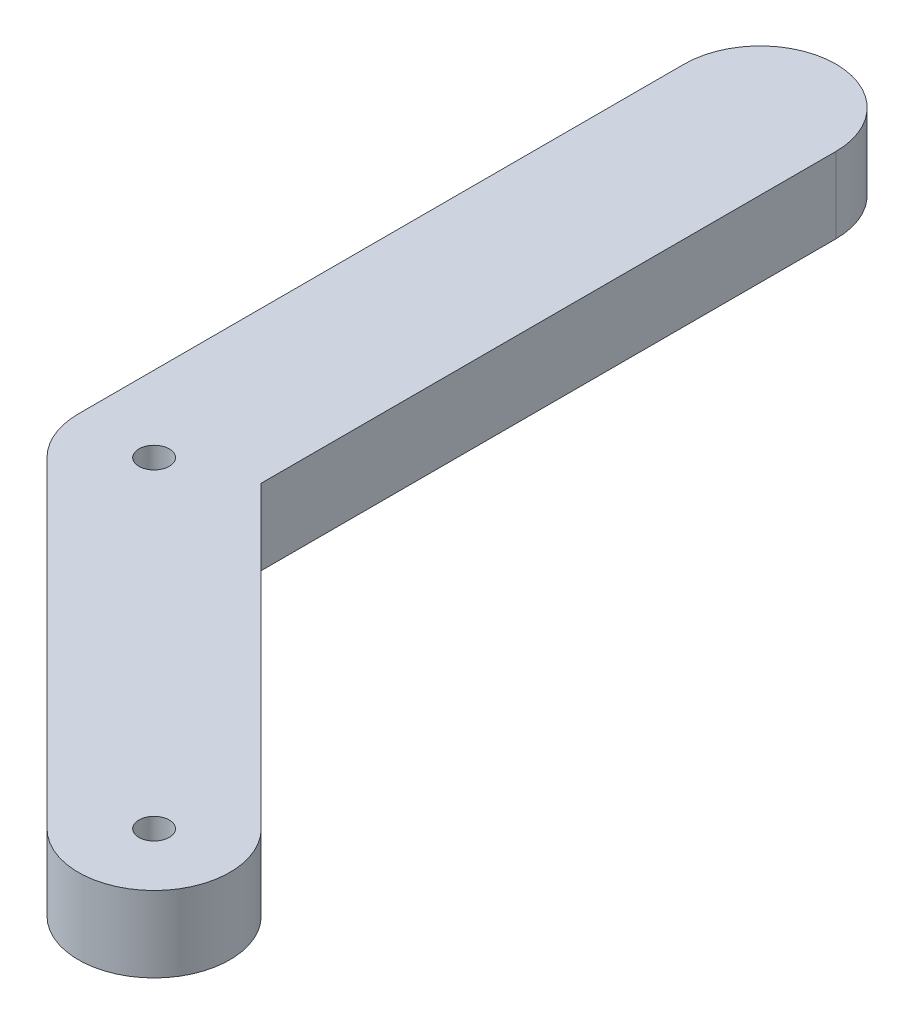
ISO-10303-21;
HEADER;
FILE_DESCRIPTION(('STEP AP214'),'2;1');
FILE_NAME('part.step','',(''),(''),'','','');
FILE_SCHEMA(('AUTOMOTIVE_DESIGN { 1 0 10303 214 1 1 1 1 }'));
ENDSEC;
DATA;
#1=APPLICATION_CONTEXT('core data for automotive mechanical design processes');
#2=APPLICATION_PROTOCOL_DEFINITION('international standard','automotive_design',2000,#1);
#3=PRODUCT_CONTEXT('',#1,'mechanical');
#4=PRODUCT('Part','Part','',(#3));
#5=PRODUCT_RELATED_PRODUCT_CATEGORY('part','',(#4));
#6=PRODUCT_DEFINITION_FORMATION('','',#4);
#7=PRODUCT_DEFINITION_CONTEXT('part definition',#1,'design');
#8=PRODUCT_DEFINITION('design','',#6,#7);
#9=PRODUCT_DEFINITION_SHAPE('','',#8);
#10=(LENGTH_UNIT() NAMED_UNIT(*) SI_UNIT(.MILLI.,.METRE.));
#11=(NAMED_UNIT(*) PLANE_ANGLE_UNIT() SI_UNIT($,.RADIAN.));
#12=(NAMED_UNIT(*) SI_UNIT($,.STERADIAN.) SOLID_ANGLE_UNIT());
#13=UNCERTAINTY_MEASURE_WITH_UNIT(LENGTH_MEASURE(1.E-05),#10,'distance_accuracy_value','');
#14=(GEOMETRIC_REPRESENTATION_CONTEXT(3) GLOBAL_UNCERTAINTY_ASSIGNED_CONTEXT((#13)) GLOBAL_UNIT_ASSIGNED_CONTEXT((#10,
#11,#12)) REPRESENTATION_CONTEXT('',''));
#15=CARTESIAN_POINT('',(0.,0.,0.));
#16=DIRECTION('',(0.,0.,1.));
#17=DIRECTION('',(1.,0.,0.));
#18=AXIS2_PLACEMENT_3D('',#15,#16,#17);
#19=CARTESIAN_POINT('',(0.,5.,-40.));
#20=DIRECTION('',(0.,1.,0.));
#21=DIRECTION('',(0.,0.,1.));
#22=AXIS2_PLACEMENT_3D('',#19,#20,#21);
#23=PLANE('',#22);
#24=CARTESIAN_POINT('',(0.,5.,0.));
#25=DIRECTION('',(0.,1.,0.));
#26=DIRECTION('',(0.,0.,1.));
#27=AXIS2_PLACEMENT_3D('',#24,#25,#26);
#28=CIRCLE('',#27,1.);
#29=CARTESIAN_POINT('',(0.,5.,1.));
#30=VERTEX_POINT('',#29);
#31=EDGE_CURVE('E140',#30,#30,#28,.T.);
#32=ORIENTED_EDGE('',*,*,#31,.F.);
#33=EDGE_LOOP('',(#32));
#34=FACE_BOUND('',#33,.T.);
#35=CARTESIAN_POINT('',(0.,5.,-40.));
#36=DIRECTION('',(0.,1.,0.));
#37=DIRECTION('',(0.,0.,1.));
#38=AXIS2_PLACEMENT_3D('',#35,#36,#37);
#39=CIRCLE('',#38,5.);
#40=CARTESIAN_POINT('',(5.,5.,-40.));
#41=VERTEX_POINT('',#40);
#42=CARTESIAN_POINT('',(-5.,5.,-40.));
#43=VERTEX_POINT('',#42);
#44=EDGE_CURVE('E155',#41,#43,#39,.T.);
#45=ORIENTED_EDGE('',*,*,#44,.T.);
#46=DIRECTION('',(0.,0.,1.));
#47=VECTOR('',#46,1.);
#48=CARTESIAN_POINT('',(-5.,5.,-40.));
#49=LINE('',#48,#47);
#50=CARTESIAN_POINT('',(-5.,5.,0.));
#51=VERTEX_POINT('',#50);
#52=EDGE_CURVE('E97',#43,#51,#49,.T.);
#53=ORIENTED_EDGE('',*,*,#52,.T.);
#54=CARTESIAN_POINT('',(0.,5.,0.));
#55=DIRECTION('',(0.,1.,0.));
#56=DIRECTION('',(0.,0.,1.));
#57=AXIS2_PLACEMENT_3D('',#54,#55,#56);
#58=CIRCLE('',#57,5.);
#59=CARTESIAN_POINT('',(-3.53553390593274,5.,3.53553390593274));
#60=VERTEX_POINT('',#59);
#61=EDGE_CURVE('E172',#51,#60,#58,.T.);
#62=ORIENTED_EDGE('',*,*,#61,.T.);
#63=DIRECTION('',(0.707106781186547,0.,0.707106781186547));
#64=VECTOR('',#63,1.);
#65=CARTESIAN_POINT('',(-3.53553390593274,5.,3.53553390593274));
#66=LINE('',#65,#64);
#67=CARTESIAN_POINT('',(17.6776695296637,5.,24.7487373415292));
#68=VERTEX_POINT('',#67);
#69=EDGE_CURVE('E113',#60,#68,#66,.T.);
#70=ORIENTED_EDGE('',*,*,#69,.T.);
#71=CARTESIAN_POINT('',(21.2132034355964,5.,21.2132034355964));
#72=DIRECTION('',(0.,1.,0.));
#73=DIRECTION('',(0.,0.,1.));
#74=AXIS2_PLACEMENT_3D('',#71,#72,#73);
#75=CIRCLE('',#74,5.);
#76=CARTESIAN_POINT('',(24.7487373415292,5.,17.6776695296637));
#77=VERTEX_POINT('',#76);
#78=EDGE_CURVE('E107',#68,#77,#75,.T.);
#79=ORIENTED_EDGE('',*,*,#78,.T.);
#80=DIRECTION('',(-0.707106781186548,0.,-0.707106781186548));
#81=VECTOR('',#80,1.);
#82=CARTESIAN_POINT('',(5.,5.,-2.07106781186547));
#83=LINE('',#82,#81);
#84=CARTESIAN_POINT('',(5.,5.,-2.07106781186547));
#85=VERTEX_POINT('',#84);
#86=EDGE_CURVE('E111',#77,#85,#83,.T.);
#87=ORIENTED_EDGE('',*,*,#86,.T.);
#88=DIRECTION('',(0.,0.,-1.));
#89=VECTOR('',#88,1.);
#90=CARTESIAN_POINT('',(5.,5.,-40.));
#91=LINE('',#90,#89);
#92=EDGE_CURVE('E57',#85,#41,#91,.T.);
#93=ORIENTED_EDGE('',*,*,#92,.T.);
#94=EDGE_LOOP('',(#45,#53,#62,#70,#79,#87,#93));
#95=FACE_BOUND('',#94,.T.);
#96=CARTESIAN_POINT('',(21.2132034355964,5.,21.2132034355964));
#97=DIRECTION('',(0.,1.,0.));
#98=DIRECTION('',(0.,0.,1.));
#99=AXIS2_PLACEMENT_3D('',#96,#97,#98);
#100=CIRCLE('',#99,1.);
#101=CARTESIAN_POINT('',(21.2132034355964,5.,22.2132034355964));
#102=VERTEX_POINT('',#101);
#103=EDGE_CURVE('E192',#102,#102,#100,.T.);
#104=ORIENTED_EDGE('',*,*,#103,.F.);
#105=EDGE_LOOP('',(#104));
#106=FACE_BOUND('',#105,.T.);
#107=ADVANCED_FACE('F39',(#34,#95,#106),#23,.T.);
#108=CARTESIAN_POINT('',(0.,0.,-40.));
#109=DIRECTION('',(0.,1.,0.));
#110=DIRECTION('',(0.,0.,1.));
#111=AXIS2_PLACEMENT_3D('',#108,#109,#110);
#112=PLANE('',#111);
#113=CARTESIAN_POINT('',(0.,0.,-40.));
#114=DIRECTION('',(0.,1.,0.));
#115=DIRECTION('',(0.,0.,1.));
#116=AXIS2_PLACEMENT_3D('',#113,#114,#115);
#117=CIRCLE('',#116,5.);
#118=CARTESIAN_POINT('',(5.,0.,-40.));
#119=VERTEX_POINT('',#118);
#120=CARTESIAN_POINT('',(-5.,0.,-40.));
#121=VERTEX_POINT('',#120);
#122=EDGE_CURVE('E135',#119,#121,#117,.T.);
#123=ORIENTED_EDGE('',*,*,#122,.F.);
#124=DIRECTION('',(0.,0.,-1.));
#125=VECTOR('',#124,1.);
#126=CARTESIAN_POINT('',(5.,0.,-40.));
#127=LINE('',#126,#125);
#128=CARTESIAN_POINT('',(5.,0.,-2.07106781186547));
#129=VERTEX_POINT('',#128);
#130=EDGE_CURVE('E89',#129,#119,#127,.T.);
#131=ORIENTED_EDGE('',*,*,#130,.F.);
#132=DIRECTION('',(-0.707106781186548,0.,-0.707106781186548));
#133=VECTOR('',#132,1.);
#134=CARTESIAN_POINT('',(5.,0.,-2.07106781186547));
#135=LINE('',#134,#133);
#136=CARTESIAN_POINT('',(24.7487373415292,0.,17.6776695296637));
#137=VERTEX_POINT('',#136);
#138=EDGE_CURVE('E83',#137,#129,#135,.T.);
#139=ORIENTED_EDGE('',*,*,#138,.F.);
#140=CARTESIAN_POINT('',(21.2132034355964,0.,21.2132034355964));
#141=DIRECTION('',(0.,1.,0.));
#142=DIRECTION('',(0.,0.,1.));
#143=AXIS2_PLACEMENT_3D('',#140,#141,#142);
#144=CIRCLE('',#143,5.);
#145=CARTESIAN_POINT('',(17.6776695296637,0.,24.7487373415292));
#146=VERTEX_POINT('',#145);
#147=EDGE_CURVE('E122',#146,#137,#144,.T.);
#148=ORIENTED_EDGE('',*,*,#147,.F.);
#149=DIRECTION('',(0.707106781186547,0.,0.707106781186547));
#150=VECTOR('',#149,1.);
#151=CARTESIAN_POINT('',(-3.53553390593274,0.,3.53553390593274));
#152=LINE('',#151,#150);
#153=CARTESIAN_POINT('',(-3.53553390593274,0.,3.53553390593274));
#154=VERTEX_POINT('',#153);
#155=EDGE_CURVE('E146',#154,#146,#152,.T.);
#156=ORIENTED_EDGE('',*,*,#155,.F.);
#157=CARTESIAN_POINT('',(0.,0.,0.));
#158=DIRECTION('',(0.,1.,0.));
#159=DIRECTION('',(0.,0.,1.));
#160=AXIS2_PLACEMENT_3D('',#157,#158,#159);
#161=CIRCLE('',#160,5.);
#162=CARTESIAN_POINT('',(-5.,0.,0.));
#163=VERTEX_POINT('',#162);
#164=EDGE_CURVE('E143',#163,#154,#161,.T.);
#165=ORIENTED_EDGE('',*,*,#164,.F.);
#166=DIRECTION('',(0.,0.,1.));
#167=VECTOR('',#166,1.);
#168=CARTESIAN_POINT('',(-5.,0.,-40.));
#169=LINE('',#168,#167);
#170=EDGE_CURVE('E139',#121,#163,#169,.T.);
#171=ORIENTED_EDGE('',*,*,#170,.F.);
#172=EDGE_LOOP('',(#123,#131,#139,#148,#156,#165,#171));
#173=FACE_BOUND('',#172,.T.);
#174=CARTESIAN_POINT('',(0.,0.,0.));
#175=DIRECTION('',(0.,1.,0.));
#176=DIRECTION('',(0.,0.,1.));
#177=AXIS2_PLACEMENT_3D('',#174,#175,#176);
#178=CIRCLE('',#177,1.);
#179=CARTESIAN_POINT('',(0.,0.,1.));
#180=VERTEX_POINT('',#179);
#181=EDGE_CURVE('E188',#180,#180,#178,.T.);
#182=ORIENTED_EDGE('',*,*,#181,.T.);
#183=EDGE_LOOP('',(#182));
#184=FACE_BOUND('',#183,.T.);
#185=CARTESIAN_POINT('',(21.2132034355964,0.,21.2132034355964));
#186=DIRECTION('',(0.,1.,0.));
#187=DIRECTION('',(0.,0.,1.));
#188=AXIS2_PLACEMENT_3D('',#185,#186,#187);
#189=CIRCLE('',#188,1.);
#190=CARTESIAN_POINT('',(21.2132034355964,0.,22.2132034355964));
#191=VERTEX_POINT('',#190);
#192=EDGE_CURVE('E196',#191,#191,#189,.T.);
#193=ORIENTED_EDGE('',*,*,#192,.T.);
#194=EDGE_LOOP('',(#193));
#195=FACE_BOUND('',#194,.T.);
#196=ADVANCED_FACE('F176',(#173,#184,#195),#112,.F.);
#197=CARTESIAN_POINT('',(0.,5.,-40.));
#198=DIRECTION('',(0.,-1.,0.));
#199=DIRECTION('',(0.,0.,-1.));
#200=AXIS2_PLACEMENT_3D('',#197,#198,#199);
#201=CYLINDRICAL_SURFACE('',#200,5.);
#202=ORIENTED_EDGE('',*,*,#122,.T.);
#203=DIRECTION('',(0.,-1.,0.));
#204=VECTOR('',#203,1.);
#205=CARTESIAN_POINT('',(-5.,5.,-40.));
#206=LINE('',#205,#204);
#207=EDGE_CURVE('E11',#43,#121,#206,.T.);
#208=ORIENTED_EDGE('',*,*,#207,.F.);
#209=ORIENTED_EDGE('',*,*,#44,.F.);
#210=DIRECTION('',(0.,-1.,0.));
#211=VECTOR('',#210,1.);
#212=CARTESIAN_POINT('',(5.,5.,-40.));
#213=LINE('',#212,#211);
#214=EDGE_CURVE('E131',#41,#119,#213,.T.);
#215=ORIENTED_EDGE('',*,*,#214,.T.);
#216=EDGE_LOOP('',(#202,#208,#209,#215));
#217=FACE_BOUND('',#216,.T.);
#218=ADVANCED_FACE('F41',(#217),#201,.T.);
#219=CARTESIAN_POINT('',(-5.,5.,-40.));
#220=DIRECTION('',(1.,0.,0.));
#221=DIRECTION('',(0.,0.,-1.));
#222=AXIS2_PLACEMENT_3D('',#219,#220,#221);
#223=PLANE('',#222);
#224=ORIENTED_EDGE('',*,*,#170,.T.);
#225=DIRECTION('',(0.,-1.,0.));
#226=VECTOR('',#225,1.);
#227=CARTESIAN_POINT('',(-5.,5.,0.));
#228=LINE('',#227,#226);
#229=EDGE_CURVE('E49',#51,#163,#228,.T.);
#230=ORIENTED_EDGE('',*,*,#229,.F.);
#231=ORIENTED_EDGE('',*,*,#52,.F.);
#232=ORIENTED_EDGE('',*,*,#207,.T.);
#233=EDGE_LOOP('',(#224,#230,#231,#232));
#234=FACE_BOUND('',#233,.T.);
#235=ADVANCED_FACE('F228',(#234),#223,.F.);
#236=CARTESIAN_POINT('',(0.,5.,0.));
#237=DIRECTION('',(0.,-1.,0.));
#238=DIRECTION('',(0.,0.,-1.));
#239=AXIS2_PLACEMENT_3D('',#236,#237,#238);
#240=CYLINDRICAL_SURFACE('',#239,5.);
#241=ORIENTED_EDGE('',*,*,#164,.T.);
#242=DIRECTION('',(0.,-1.,0.));
#243=VECTOR('',#242,1.);
#244=CARTESIAN_POINT('',(-3.53553390593274,5.,3.53553390593274));
#245=LINE('',#244,#243);
#246=EDGE_CURVE('E162',#60,#154,#245,.T.);
#247=ORIENTED_EDGE('',*,*,#246,.F.);
#248=ORIENTED_EDGE('',*,*,#61,.F.);
#249=ORIENTED_EDGE('',*,*,#229,.T.);
#250=EDGE_LOOP('',(#241,#247,#248,#249));
#251=FACE_BOUND('',#250,.T.);
#252=ADVANCED_FACE('F170',(#251),#240,.T.);
#253=CARTESIAN_POINT('',(-3.53553390593274,5.,3.53553390593274));
#254=DIRECTION('',(0.707106781186548,0.,-0.707106781186548));
#255=DIRECTION('',(-0.707106781186548,0.,-0.707106781186548));
#256=AXIS2_PLACEMENT_3D('',#253,#254,#255);
#257=PLANE('',#256);
#258=ORIENTED_EDGE('',*,*,#155,.T.);
#259=DIRECTION('',(0.,-1.,0.));
#260=VECTOR('',#259,1.);
#261=CARTESIAN_POINT('',(17.6776695296637,5.,24.7487373415292));
#262=LINE('',#261,#260);
#263=EDGE_CURVE('E124',#68,#146,#262,.T.);
#264=ORIENTED_EDGE('',*,*,#263,.F.);
#265=ORIENTED_EDGE('',*,*,#69,.F.);
#266=ORIENTED_EDGE('',*,*,#246,.T.);
#267=EDGE_LOOP('',(#258,#264,#265,#266));
#268=FACE_BOUND('',#267,.T.);
#269=ADVANCED_FACE('F179',(#268),#257,.F.);
#270=CARTESIAN_POINT('',(21.2132034355964,5.,21.2132034355964));
#271=DIRECTION('',(0.,-1.,0.));
#272=DIRECTION('',(0.,0.,-1.));
#273=AXIS2_PLACEMENT_3D('',#270,#271,#272);
#274=CYLINDRICAL_SURFACE('',#273,5.);
#275=ORIENTED_EDGE('',*,*,#147,.T.);
#276=DIRECTION('',(0.,-1.,0.));
#277=VECTOR('',#276,1.);
#278=CARTESIAN_POINT('',(24.7487373415292,5.,17.6776695296637));
#279=LINE('',#278,#277);
#280=EDGE_CURVE('E119',#77,#137,#279,.T.);
#281=ORIENTED_EDGE('',*,*,#280,.F.);
#282=ORIENTED_EDGE('',*,*,#78,.F.);
#283=ORIENTED_EDGE('',*,*,#263,.T.);
#284=EDGE_LOOP('',(#275,#281,#282,#283));
#285=FACE_BOUND('',#284,.T.);
#286=ADVANCED_FACE('F120',(#285),#274,.T.);
#287=CARTESIAN_POINT('',(5.,5.,-2.07106781186547));
#288=DIRECTION('',(-0.707106781186548,0.,0.707106781186548));
#289=DIRECTION('',(0.707106781186548,0.,0.707106781186548));
#290=AXIS2_PLACEMENT_3D('',#287,#288,#289);
#291=PLANE('',#290);
#292=ORIENTED_EDGE('',*,*,#138,.T.);
#293=DIRECTION('',(0.,-1.,0.));
#294=VECTOR('',#293,1.);
#295=CARTESIAN_POINT('',(5.,5.,-2.07106781186547));
#296=LINE('',#295,#294);
#297=EDGE_CURVE('E125',#85,#129,#296,.T.);
#298=ORIENTED_EDGE('',*,*,#297,.F.);
#299=ORIENTED_EDGE('',*,*,#86,.F.);
#300=ORIENTED_EDGE('',*,*,#280,.T.);
#301=EDGE_LOOP('',(#292,#298,#299,#300));
#302=FACE_BOUND('',#301,.T.);
#303=ADVANCED_FACE('F127',(#302),#291,.F.);
#304=CARTESIAN_POINT('',(5.,5.,-40.));
#305=DIRECTION('',(-1.,0.,0.));
#306=DIRECTION('',(0.,0.,1.));
#307=AXIS2_PLACEMENT_3D('',#304,#305,#306);
#308=PLANE('',#307);
#309=ORIENTED_EDGE('',*,*,#130,.T.);
#310=ORIENTED_EDGE('',*,*,#214,.F.);
#311=ORIENTED_EDGE('',*,*,#92,.F.);
#312=ORIENTED_EDGE('',*,*,#297,.T.);
#313=EDGE_LOOP('',(#309,#310,#311,#312));
#314=FACE_BOUND('',#313,.T.);
#315=ADVANCED_FACE('F218',(#314),#308,.F.);
#316=CARTESIAN_POINT('',(0.,5.,0.));
#317=DIRECTION('',(0.,-1.,0.));
#318=DIRECTION('',(0.,0.,-1.));
#319=AXIS2_PLACEMENT_3D('',#316,#317,#318);
#320=CYLINDRICAL_SURFACE('',#319,1.);
#321=ORIENTED_EDGE('',*,*,#31,.T.);
#322=EDGE_LOOP('',(#321));
#323=FACE_BOUND('',#322,.T.);
#324=ORIENTED_EDGE('',*,*,#181,.F.);
#325=EDGE_LOOP('',(#324));
#326=FACE_BOUND('',#325,.T.);
#327=ADVANCED_FACE('F215',(#323,#326),#320,.F.);
#328=CARTESIAN_POINT('',(21.2132034355964,5.,21.2132034355964));
#329=DIRECTION('',(0.,-1.,0.));
#330=DIRECTION('',(0.,0.,-1.));
#331=AXIS2_PLACEMENT_3D('',#328,#329,#330);
#332=CYLINDRICAL_SURFACE('',#331,1.);
#333=ORIENTED_EDGE('',*,*,#103,.T.);
#334=EDGE_LOOP('',(#333));
#335=FACE_BOUND('',#334,.T.);
#336=ORIENTED_EDGE('',*,*,#192,.F.);
#337=EDGE_LOOP('',(#336));
#338=FACE_BOUND('',#337,.T.);
#339=ADVANCED_FACE('F204',(#335,#338),#332,.F.);
#340=CLOSED_SHELL('',(#107,#196,#218,#235,#252,#269,#286,#303,#315,#327,#339));
#341=MANIFOLD_SOLID_BREP('B2',#340);
#342=ADVANCED_BREP_SHAPE_REPRESENTATION('',(#18,#341),#14);
#343=SHAPE_DEFINITION_REPRESENTATION(#9,#342);
ENDSEC;
END-ISO-10303-21;
